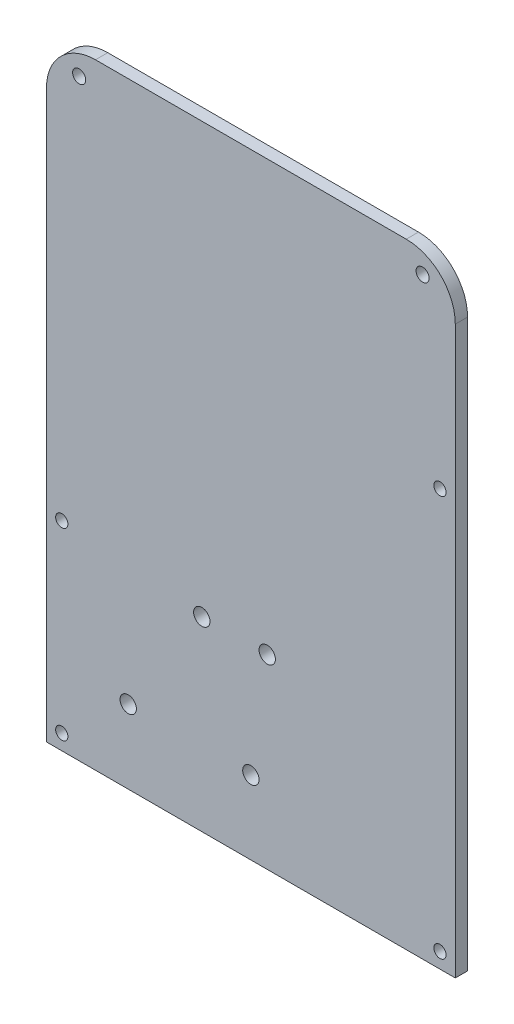
ISO-10303-21;
HEADER;
FILE_DESCRIPTION(('STEP AP214'),'2;1');
FILE_NAME('part.step','',(''),(''),'','','');
FILE_SCHEMA(('AUTOMOTIVE_DESIGN { 1 0 10303 214 1 1 1 1 }'));
ENDSEC;
DATA;
#1=APPLICATION_CONTEXT('core data for automotive mechanical design processes');
#2=APPLICATION_PROTOCOL_DEFINITION('international standard','automotive_design',2000,#1);
#3=PRODUCT_CONTEXT('',#1,'mechanical');
#4=PRODUCT('Part','Part','',(#3));
#5=PRODUCT_RELATED_PRODUCT_CATEGORY('part','',(#4));
#6=PRODUCT_DEFINITION_FORMATION('','',#4);
#7=PRODUCT_DEFINITION_CONTEXT('part definition',#1,'design');
#8=PRODUCT_DEFINITION('design','',#6,#7);
#9=PRODUCT_DEFINITION_SHAPE('','',#8);
#10=(LENGTH_UNIT() NAMED_UNIT(*) SI_UNIT(.MILLI.,.METRE.));
#11=(NAMED_UNIT(*) PLANE_ANGLE_UNIT() SI_UNIT($,.RADIAN.));
#12=(NAMED_UNIT(*) SI_UNIT($,.STERADIAN.) SOLID_ANGLE_UNIT());
#13=UNCERTAINTY_MEASURE_WITH_UNIT(LENGTH_MEASURE(1.E-05),#10,'distance_accuracy_value','');
#14=(GEOMETRIC_REPRESENTATION_CONTEXT(3) GLOBAL_UNCERTAINTY_ASSIGNED_CONTEXT((#13)) GLOBAL_UNIT_ASSIGNED_CONTEXT((#10,
#11,#12)) REPRESENTATION_CONTEXT('',''));
#15=CARTESIAN_POINT('',(0.,0.,0.));
#16=DIRECTION('',(0.,0.,1.));
#17=DIRECTION('',(1.,0.,0.));
#18=AXIS2_PLACEMENT_3D('',#15,#16,#17);
#19=CARTESIAN_POINT('',(-160.53479172773,-113.267977094627,3.));
#20=DIRECTION('',(1.,0.,0.));
#21=DIRECTION('',(0.,0.,-1.));
#22=AXIS2_PLACEMENT_3D('',#19,#20,#21);
#23=PLANE('',#22);
#24=DIRECTION('',(0.,-1.,0.));
#25=VECTOR('',#24,1.);
#26=CARTESIAN_POINT('',(-160.53479172773,-113.267977094627,3.));
#27=LINE('',#26,#25);
#28=CARTESIAN_POINT('',(-160.53479172773,25.2320229053735,3.));
#29=VERTEX_POINT('',#28);
#30=CARTESIAN_POINT('',(-160.53479172773,-113.267977094627,3.));
#31=VERTEX_POINT('',#30);
#32=EDGE_CURVE('E111',#29,#31,#27,.T.);
#33=ORIENTED_EDGE('',*,*,#32,.F.);
#34=DIRECTION('',(0.,0.,-1.));
#35=VECTOR('',#34,1.);
#36=CARTESIAN_POINT('',(-160.53479172773,25.2320229053735,3.));
#37=LINE('',#36,#35);
#38=CARTESIAN_POINT('',(-160.53479172773,25.2320229053735,0.));
#39=VERTEX_POINT('',#38);
#40=EDGE_CURVE('E136',#29,#39,#37,.T.);
#41=ORIENTED_EDGE('',*,*,#40,.T.);
#42=DIRECTION('',(0.,-1.,0.));
#43=VECTOR('',#42,1.);
#44=CARTESIAN_POINT('',(-160.53479172773,-113.267977094627,0.));
#45=LINE('',#44,#43);
#46=CARTESIAN_POINT('',(-160.53479172773,-113.267977094627,0.));
#47=VERTEX_POINT('',#46);
#48=EDGE_CURVE('E134',#39,#47,#45,.T.);
#49=ORIENTED_EDGE('',*,*,#48,.T.);
#50=DIRECTION('',(0.,0.,-1.));
#51=VECTOR('',#50,1.);
#52=CARTESIAN_POINT('',(-160.53479172773,-113.267977094627,3.));
#53=LINE('',#52,#51);
#54=EDGE_CURVE('E127',#31,#47,#53,.T.);
#55=ORIENTED_EDGE('',*,*,#54,.F.);
#56=EDGE_LOOP('',(#33,#41,#49,#55));
#57=FACE_BOUND('',#56,.T.);
#58=ADVANCED_FACE('F47',(#57),#23,.F.);
#59=CARTESIAN_POINT('',(-160.53479172773,-113.267977094627,3.));
#60=DIRECTION('',(0.,1.,0.));
#61=DIRECTION('',(0.,0.,1.));
#62=AXIS2_PLACEMENT_3D('',#59,#60,#61);
#63=PLANE('',#62);
#64=DIRECTION('',(1.,0.,0.));
#65=VECTOR('',#64,1.);
#66=CARTESIAN_POINT('',(-160.53479172773,-113.267977094627,0.));
#67=LINE('',#66,#65);
#68=CARTESIAN_POINT('',(-60.53479172773,-113.267977094627,0.));
#69=VERTEX_POINT('',#68);
#70=EDGE_CURVE('E238',#47,#69,#67,.T.);
#71=ORIENTED_EDGE('',*,*,#70,.T.);
#72=DIRECTION('',(0.,0.,-1.));
#73=VECTOR('',#72,1.);
#74=CARTESIAN_POINT('',(-60.53479172773,-113.267977094627,3.));
#75=LINE('',#74,#73);
#76=CARTESIAN_POINT('',(-60.53479172773,-113.267977094627,3.));
#77=VERTEX_POINT('',#76);
#78=EDGE_CURVE('E129',#77,#69,#75,.T.);
#79=ORIENTED_EDGE('',*,*,#78,.F.);
#80=DIRECTION('',(1.,0.,0.));
#81=VECTOR('',#80,1.);
#82=CARTESIAN_POINT('',(-160.53479172773,-113.267977094627,3.));
#83=LINE('',#82,#81);
#84=EDGE_CURVE('E114',#31,#77,#83,.T.);
#85=ORIENTED_EDGE('',*,*,#84,.F.);
#86=ORIENTED_EDGE('',*,*,#54,.T.);
#87=EDGE_LOOP('',(#71,#79,#85,#86));
#88=FACE_BOUND('',#87,.T.);
#89=ADVANCED_FACE('F126',(#88),#63,.F.);
#90=CARTESIAN_POINT('',(-60.53479172773,-113.267977094627,3.));
#91=DIRECTION('',(-1.,0.,0.));
#92=DIRECTION('',(0.,0.,1.));
#93=AXIS2_PLACEMENT_3D('',#90,#91,#92);
#94=PLANE('',#93);
#95=DIRECTION('',(0.,1.,0.));
#96=VECTOR('',#95,1.);
#97=CARTESIAN_POINT('',(-60.53479172773,-113.267977094627,0.));
#98=LINE('',#97,#96);
#99=CARTESIAN_POINT('',(-60.53479172773,25.2320229053735,0.));
#100=VERTEX_POINT('',#99);
#101=EDGE_CURVE('E241',#69,#100,#98,.T.);
#102=ORIENTED_EDGE('',*,*,#101,.T.);
#103=DIRECTION('',(0.,0.,-1.));
#104=VECTOR('',#103,1.);
#105=CARTESIAN_POINT('',(-60.53479172773,25.2320229053735,3.));
#106=LINE('',#105,#104);
#107=CARTESIAN_POINT('',(-60.53479172773,25.2320229053735,3.));
#108=VERTEX_POINT('',#107);
#109=EDGE_CURVE('E11',#100,#108,#106,.F.);
#110=ORIENTED_EDGE('',*,*,#109,.T.);
#111=DIRECTION('',(0.,1.,0.));
#112=VECTOR('',#111,1.);
#113=CARTESIAN_POINT('',(-60.53479172773,-113.267977094627,3.));
#114=LINE('',#113,#112);
#115=EDGE_CURVE('E131',#77,#108,#114,.T.);
#116=ORIENTED_EDGE('',*,*,#115,.F.);
#117=ORIENTED_EDGE('',*,*,#78,.T.);
#118=EDGE_LOOP('',(#102,#110,#116,#117));
#119=FACE_BOUND('',#118,.T.);
#120=ADVANCED_FACE('F252',(#119),#94,.F.);
#121=CARTESIAN_POINT('',(-160.53479172773,37.2320229053735,3.));
#122=DIRECTION('',(0.,-1.,0.));
#123=DIRECTION('',(0.,0.,-1.));
#124=AXIS2_PLACEMENT_3D('',#121,#122,#123);
#125=PLANE('',#124);
#126=DIRECTION('',(-1.,0.,0.));
#127=VECTOR('',#126,1.);
#128=CARTESIAN_POINT('',(-160.53479172773,37.2320229053735,0.));
#129=LINE('',#128,#127);
#130=CARTESIAN_POINT('',(-72.53479172773,37.2320229053735,0.));
#131=VERTEX_POINT('',#130);
#132=CARTESIAN_POINT('',(-148.53479172773,37.2320229053735,0.));
#133=VERTEX_POINT('',#132);
#134=EDGE_CURVE('E122',#131,#133,#129,.T.);
#135=ORIENTED_EDGE('',*,*,#134,.T.);
#136=DIRECTION('',(0.,0.,-1.));
#137=VECTOR('',#136,1.);
#138=CARTESIAN_POINT('',(-148.53479172773,37.2320229053735,3.));
#139=LINE('',#138,#137);
#140=CARTESIAN_POINT('',(-148.53479172773,37.2320229053735,3.));
#141=VERTEX_POINT('',#140);
#142=EDGE_CURVE('E76',#133,#141,#139,.F.);
#143=ORIENTED_EDGE('',*,*,#142,.T.);
#144=DIRECTION('',(-1.,0.,0.));
#145=VECTOR('',#144,1.);
#146=CARTESIAN_POINT('',(-160.53479172773,37.2320229053735,3.));
#147=LINE('',#146,#145);
#148=CARTESIAN_POINT('',(-72.53479172773,37.2320229053735,3.));
#149=VERTEX_POINT('',#148);
#150=EDGE_CURVE('E142',#149,#141,#147,.T.);
#151=ORIENTED_EDGE('',*,*,#150,.F.);
#152=DIRECTION('',(0.,0.,-1.));
#153=VECTOR('',#152,1.);
#154=CARTESIAN_POINT('',(-72.53479172773,37.2320229053735,3.));
#155=LINE('',#154,#153);
#156=EDGE_CURVE('E150',#149,#131,#155,.T.);
#157=ORIENTED_EDGE('',*,*,#156,.T.);
#158=EDGE_LOOP('',(#135,#143,#151,#157));
#159=FACE_BOUND('',#158,.T.);
#160=ADVANCED_FACE('F245',(#159),#125,.F.);
#161=CARTESIAN_POINT('',(0.,0.,3.));
#162=DIRECTION('',(0.,0.,-1.));
#163=DIRECTION('',(-1.,0.,0.));
#164=AXIS2_PLACEMENT_3D('',#161,#162,#163);
#165=PLANE('',#164);
#166=CARTESIAN_POINT('',(-152.53479172773,31.7320229053735,3.));
#167=DIRECTION('',(0.,0.,1.));
#168=DIRECTION('',(1.,0.,0.));
#169=AXIS2_PLACEMENT_3D('',#166,#167,#168);
#170=CIRCLE('',#169,1.59999999999999);
#171=CARTESIAN_POINT('',(-150.93479172773,31.7320229053735,3.));
#172=VERTEX_POINT('',#171);
#173=EDGE_CURVE('E161',#172,#172,#170,.T.);
#174=ORIENTED_EDGE('',*,*,#173,.F.);
#175=EDGE_LOOP('',(#174));
#176=FACE_BOUND('',#175,.T.);
#177=CARTESIAN_POINT('',(-68.53479172773,31.7320229053735,3.));
#178=DIRECTION('',(0.,0.,1.));
#179=DIRECTION('',(1.,0.,0.));
#180=AXIS2_PLACEMENT_3D('',#177,#178,#179);
#181=CIRCLE('',#180,1.60000000000001);
#182=CARTESIAN_POINT('',(-66.93479172773,31.7320229053735,3.));
#183=VERTEX_POINT('',#182);
#184=EDGE_CURVE('E169',#183,#183,#181,.T.);
#185=ORIENTED_EDGE('',*,*,#184,.F.);
#186=EDGE_LOOP('',(#185));
#187=FACE_BOUND('',#186,.T.);
#188=CARTESIAN_POINT('',(-140.53479172773,-95.2679770946265,3.));
#189=DIRECTION('',(0.,0.,1.));
#190=DIRECTION('',(1.,0.,0.));
#191=AXIS2_PLACEMENT_3D('',#188,#189,#190);
#192=CIRCLE('',#191,2.);
#193=CARTESIAN_POINT('',(-138.53479172773,-95.2679770946265,3.));
#194=VERTEX_POINT('',#193);
#195=EDGE_CURVE('E183',#194,#194,#192,.T.);
#196=ORIENTED_EDGE('',*,*,#195,.F.);
#197=EDGE_LOOP('',(#196));
#198=FACE_BOUND('',#197,.T.);
#199=CARTESIAN_POINT('',(-110.53479172773,-95.2679770946265,3.));
#200=DIRECTION('',(0.,0.,1.));
#201=DIRECTION('',(1.,0.,0.));
#202=AXIS2_PLACEMENT_3D('',#199,#200,#201);
#203=CIRCLE('',#202,2.);
#204=CARTESIAN_POINT('',(-108.53479172773,-95.2679770946265,3.));
#205=VERTEX_POINT('',#204);
#206=EDGE_CURVE('E187',#205,#205,#203,.T.);
#207=ORIENTED_EDGE('',*,*,#206,.F.);
#208=EDGE_LOOP('',(#207));
#209=FACE_BOUND('',#208,.T.);
#210=CARTESIAN_POINT('',(-106.53479172773,-67.7679770946265,3.));
#211=DIRECTION('',(0.,0.,1.));
#212=DIRECTION('',(1.,0.,0.));
#213=AXIS2_PLACEMENT_3D('',#210,#211,#212);
#214=CIRCLE('',#213,2.);
#215=CARTESIAN_POINT('',(-104.53479172773,-67.7679770946265,3.));
#216=VERTEX_POINT('',#215);
#217=EDGE_CURVE('E195',#216,#216,#214,.T.);
#218=ORIENTED_EDGE('',*,*,#217,.F.);
#219=EDGE_LOOP('',(#218));
#220=FACE_BOUND('',#219,.T.);
#221=CARTESIAN_POINT('',(-122.53479172773,-67.7679770946265,3.));
#222=DIRECTION('',(0.,0.,1.));
#223=DIRECTION('',(1.,0.,0.));
#224=AXIS2_PLACEMENT_3D('',#221,#222,#223);
#225=CIRCLE('',#224,2.);
#226=CARTESIAN_POINT('',(-120.53479172773,-67.7679770946265,3.));
#227=VERTEX_POINT('',#226);
#228=EDGE_CURVE('E201',#227,#227,#225,.T.);
#229=ORIENTED_EDGE('',*,*,#228,.F.);
#230=EDGE_LOOP('',(#229));
#231=FACE_BOUND('',#230,.T.);
#232=CARTESIAN_POINT('',(-156.78479172773,-64.5179770946265,3.));
#233=DIRECTION('',(0.,0.,1.));
#234=DIRECTION('',(1.,0.,0.));
#235=AXIS2_PLACEMENT_3D('',#232,#233,#234);
#236=CIRCLE('',#235,1.5);
#237=CARTESIAN_POINT('',(-155.28479172773,-64.5179770946265,3.));
#238=VERTEX_POINT('',#237);
#239=EDGE_CURVE('E223',#238,#238,#236,.T.);
#240=ORIENTED_EDGE('',*,*,#239,.F.);
#241=EDGE_LOOP('',(#240));
#242=FACE_BOUND('',#241,.T.);
#243=CARTESIAN_POINT('',(-64.28479172773,-11.5179770946265,3.));
#244=DIRECTION('',(0.,0.,1.));
#245=DIRECTION('',(1.,0.,0.));
#246=AXIS2_PLACEMENT_3D('',#243,#244,#245);
#247=CIRCLE('',#246,1.5);
#248=CARTESIAN_POINT('',(-62.78479172773,-11.5179770946265,3.));
#249=VERTEX_POINT('',#248);
#250=EDGE_CURVE('E215',#249,#249,#247,.T.);
#251=ORIENTED_EDGE('',*,*,#250,.F.);
#252=EDGE_LOOP('',(#251));
#253=FACE_BOUND('',#252,.T.);
#254=CARTESIAN_POINT('',(-64.28479172773,-109.517977094627,3.));
#255=DIRECTION('',(0.,0.,1.));
#256=DIRECTION('',(1.,0.,0.));
#257=AXIS2_PLACEMENT_3D('',#254,#255,#256);
#258=CIRCLE('',#257,1.5);
#259=CARTESIAN_POINT('',(-62.78479172773,-109.517977094627,3.));
#260=VERTEX_POINT('',#259);
#261=EDGE_CURVE('E206',#260,#260,#258,.T.);
#262=ORIENTED_EDGE('',*,*,#261,.F.);
#263=EDGE_LOOP('',(#262));
#264=FACE_BOUND('',#263,.T.);
#265=CARTESIAN_POINT('',(-156.78479172773,-109.517977094627,3.));
#266=DIRECTION('',(0.,0.,1.));
#267=DIRECTION('',(1.,0.,0.));
#268=AXIS2_PLACEMENT_3D('',#265,#266,#267);
#269=CIRCLE('',#268,1.5);
#270=CARTESIAN_POINT('',(-155.28479172773,-109.517977094627,3.));
#271=VERTEX_POINT('',#270);
#272=EDGE_CURVE('E210',#271,#271,#269,.T.);
#273=ORIENTED_EDGE('',*,*,#272,.F.);
#274=EDGE_LOOP('',(#273));
#275=FACE_BOUND('',#274,.T.);
#276=ORIENTED_EDGE('',*,*,#150,.T.);
#277=CARTESIAN_POINT('',(-148.53479172773,25.2320229053735,3.));
#278=DIRECTION('',(0.,0.,-1.));
#279=DIRECTION('',(-1.,0.,0.));
#280=AXIS2_PLACEMENT_3D('',#277,#278,#279);
#281=CIRCLE('',#280,12.);
#282=EDGE_CURVE('E57',#141,#29,#281,.F.);
#283=ORIENTED_EDGE('',*,*,#282,.T.);
#284=ORIENTED_EDGE('',*,*,#32,.T.);
#285=ORIENTED_EDGE('',*,*,#84,.T.);
#286=ORIENTED_EDGE('',*,*,#115,.T.);
#287=CARTESIAN_POINT('',(-72.53479172773,25.2320229053735,3.));
#288=DIRECTION('',(0.,0.,-1.));
#289=DIRECTION('',(-1.,0.,0.));
#290=AXIS2_PLACEMENT_3D('',#287,#288,#289);
#291=CIRCLE('',#290,12.);
#292=EDGE_CURVE('E155',#108,#149,#291,.F.);
#293=ORIENTED_EDGE('',*,*,#292,.T.);
#294=EDGE_LOOP('',(#276,#283,#284,#285,#286,#293));
#295=FACE_BOUND('',#294,.T.);
#296=ADVANCED_FACE('F113',(#176,#187,#198,#209,#220,#231,#242,#253,#264,#275,#295),#165,.F.);
#297=CARTESIAN_POINT('',(0.,0.,0.));
#298=DIRECTION('',(0.,0.,-1.));
#299=DIRECTION('',(-1.,0.,0.));
#300=AXIS2_PLACEMENT_3D('',#297,#298,#299);
#301=PLANE('',#300);
#302=CARTESIAN_POINT('',(-152.53479172773,31.7320229053735,0.));
#303=DIRECTION('',(0.,0.,-1.));
#304=DIRECTION('',(-1.,0.,0.));
#305=AXIS2_PLACEMENT_3D('',#302,#303,#304);
#306=CIRCLE('',#305,1.59999999999999);
#307=CARTESIAN_POINT('',(-154.13479172773,31.7320229053735,0.));
#308=VERTEX_POINT('',#307);
#309=EDGE_CURVE('E51',#308,#308,#306,.T.);
#310=ORIENTED_EDGE('',*,*,#309,.F.);
#311=EDGE_LOOP('',(#310));
#312=FACE_BOUND('',#311,.T.);
#313=CARTESIAN_POINT('',(-68.53479172773,31.7320229053735,0.));
#314=DIRECTION('',(0.,0.,-1.));
#315=DIRECTION('',(-1.,0.,0.));
#316=AXIS2_PLACEMENT_3D('',#313,#314,#315);
#317=CIRCLE('',#316,1.60000000000001);
#318=CARTESIAN_POINT('',(-70.13479172773,31.7320229053735,0.));
#319=VERTEX_POINT('',#318);
#320=EDGE_CURVE('E159',#319,#319,#317,.T.);
#321=ORIENTED_EDGE('',*,*,#320,.F.);
#322=EDGE_LOOP('',(#321));
#323=FACE_BOUND('',#322,.T.);
#324=CARTESIAN_POINT('',(-140.53479172773,-95.2679770946265,0.));
#325=DIRECTION('',(0.,0.,1.));
#326=DIRECTION('',(1.,0.,0.));
#327=AXIS2_PLACEMENT_3D('',#324,#325,#326);
#328=CIRCLE('',#327,2.);
#329=CARTESIAN_POINT('',(-138.53479172773,-95.2679770946265,0.));
#330=VERTEX_POINT('',#329);
#331=EDGE_CURVE('E178',#330,#330,#328,.T.);
#332=ORIENTED_EDGE('',*,*,#331,.T.);
#333=EDGE_LOOP('',(#332));
#334=FACE_BOUND('',#333,.T.);
#335=CARTESIAN_POINT('',(-110.53479172773,-95.2679770946265,0.));
#336=DIRECTION('',(0.,0.,1.));
#337=DIRECTION('',(1.,0.,0.));
#338=AXIS2_PLACEMENT_3D('',#335,#336,#337);
#339=CIRCLE('',#338,2.);
#340=CARTESIAN_POINT('',(-108.53479172773,-95.2679770946265,0.));
#341=VERTEX_POINT('',#340);
#342=EDGE_CURVE('E191',#341,#341,#339,.T.);
#343=ORIENTED_EDGE('',*,*,#342,.T.);
#344=EDGE_LOOP('',(#343));
#345=FACE_BOUND('',#344,.T.);
#346=CARTESIAN_POINT('',(-106.53479172773,-67.7679770946265,0.));
#347=DIRECTION('',(0.,0.,1.));
#348=DIRECTION('',(1.,0.,0.));
#349=AXIS2_PLACEMENT_3D('',#346,#347,#348);
#350=CIRCLE('',#349,2.);
#351=CARTESIAN_POINT('',(-104.53479172773,-67.7679770946265,0.));
#352=VERTEX_POINT('',#351);
#353=EDGE_CURVE('E198',#352,#352,#350,.T.);
#354=ORIENTED_EDGE('',*,*,#353,.T.);
#355=EDGE_LOOP('',(#354));
#356=FACE_BOUND('',#355,.T.);
#357=CARTESIAN_POINT('',(-122.53479172773,-67.7679770946265,0.));
#358=DIRECTION('',(0.,0.,1.));
#359=DIRECTION('',(1.,0.,0.));
#360=AXIS2_PLACEMENT_3D('',#357,#358,#359);
#361=CIRCLE('',#360,2.);
#362=CARTESIAN_POINT('',(-120.53479172773,-67.7679770946265,0.));
#363=VERTEX_POINT('',#362);
#364=EDGE_CURVE('E166',#363,#363,#361,.T.);
#365=ORIENTED_EDGE('',*,*,#364,.T.);
#366=EDGE_LOOP('',(#365));
#367=FACE_BOUND('',#366,.T.);
#368=CARTESIAN_POINT('',(-156.78479172773,-64.5179770946265,0.));
#369=DIRECTION('',(0.,0.,1.));
#370=DIRECTION('',(1.,0.,0.));
#371=AXIS2_PLACEMENT_3D('',#368,#369,#370);
#372=CIRCLE('',#371,1.5);
#373=CARTESIAN_POINT('',(-155.28479172773,-64.5179770946265,0.));
#374=VERTEX_POINT('',#373);
#375=EDGE_CURVE('E182',#374,#374,#372,.T.);
#376=ORIENTED_EDGE('',*,*,#375,.T.);
#377=EDGE_LOOP('',(#376));
#378=FACE_BOUND('',#377,.T.);
#379=CARTESIAN_POINT('',(-64.28479172773,-11.5179770946265,0.));
#380=DIRECTION('',(0.,0.,1.));
#381=DIRECTION('',(1.,0.,0.));
#382=AXIS2_PLACEMENT_3D('',#379,#380,#381);
#383=CIRCLE('',#382,1.5);
#384=CARTESIAN_POINT('',(-62.78479172773,-11.5179770946265,0.));
#385=VERTEX_POINT('',#384);
#386=EDGE_CURVE('E219',#385,#385,#383,.T.);
#387=ORIENTED_EDGE('',*,*,#386,.T.);
#388=EDGE_LOOP('',(#387));
#389=FACE_BOUND('',#388,.T.);
#390=CARTESIAN_POINT('',(-64.28479172773,-109.517977094627,0.));
#391=DIRECTION('',(0.,0.,1.));
#392=DIRECTION('',(1.,0.,0.));
#393=AXIS2_PLACEMENT_3D('',#390,#391,#392);
#394=CIRCLE('',#393,1.5);
#395=CARTESIAN_POINT('',(-62.78479172773,-109.517977094627,0.));
#396=VERTEX_POINT('',#395);
#397=EDGE_CURVE('E211',#396,#396,#394,.T.);
#398=ORIENTED_EDGE('',*,*,#397,.T.);
#399=EDGE_LOOP('',(#398));
#400=FACE_BOUND('',#399,.T.);
#401=CARTESIAN_POINT('',(-156.78479172773,-109.517977094627,0.));
#402=DIRECTION('',(0.,0.,1.));
#403=DIRECTION('',(1.,0.,0.));
#404=AXIS2_PLACEMENT_3D('',#401,#402,#403);
#405=CIRCLE('',#404,1.5);
#406=CARTESIAN_POINT('',(-155.28479172773,-109.517977094627,0.));
#407=VERTEX_POINT('',#406);
#408=EDGE_CURVE('E228',#407,#407,#405,.T.);
#409=ORIENTED_EDGE('',*,*,#408,.T.);
#410=EDGE_LOOP('',(#409));
#411=FACE_BOUND('',#410,.T.);
#412=ORIENTED_EDGE('',*,*,#48,.F.);
#413=CARTESIAN_POINT('',(-148.53479172773,25.2320229053735,0.));
#414=DIRECTION('',(0.,0.,-1.));
#415=DIRECTION('',(-1.,0.,0.));
#416=AXIS2_PLACEMENT_3D('',#413,#414,#415);
#417=CIRCLE('',#416,12.);
#418=EDGE_CURVE('E147',#39,#133,#417,.T.);
#419=ORIENTED_EDGE('',*,*,#418,.T.);
#420=ORIENTED_EDGE('',*,*,#134,.F.);
#421=CARTESIAN_POINT('',(-72.53479172773,25.2320229053735,0.));
#422=DIRECTION('',(0.,0.,-1.));
#423=DIRECTION('',(-1.,0.,0.));
#424=AXIS2_PLACEMENT_3D('',#421,#422,#423);
#425=CIRCLE('',#424,12.);
#426=EDGE_CURVE('E139',#131,#100,#425,.T.);
#427=ORIENTED_EDGE('',*,*,#426,.T.);
#428=ORIENTED_EDGE('',*,*,#101,.F.);
#429=ORIENTED_EDGE('',*,*,#70,.F.);
#430=EDGE_LOOP('',(#412,#419,#420,#427,#428,#429));
#431=FACE_BOUND('',#430,.T.);
#432=ADVANCED_FACE('F250',(#312,#323,#334,#345,#356,#367,#378,#389,#400,#411,#431),#301,.T.);
#433=CARTESIAN_POINT('',(-156.78479172773,-109.517977094627,0.));
#434=DIRECTION('',(0.,0.,1.));
#435=DIRECTION('',(1.,0.,0.));
#436=AXIS2_PLACEMENT_3D('',#433,#434,#435);
#437=CYLINDRICAL_SURFACE('',#436,1.5);
#438=ORIENTED_EDGE('',*,*,#408,.F.);
#439=EDGE_LOOP('',(#438));
#440=FACE_BOUND('',#439,.T.);
#441=ORIENTED_EDGE('',*,*,#272,.T.);
#442=EDGE_LOOP('',(#441));
#443=FACE_BOUND('',#442,.T.);
#444=ADVANCED_FACE('F277',(#440,#443),#437,.F.);
#445=CARTESIAN_POINT('',(-64.28479172773,-109.517977094627,0.));
#446=DIRECTION('',(0.,0.,1.));
#447=DIRECTION('',(1.,0.,0.));
#448=AXIS2_PLACEMENT_3D('',#445,#446,#447);
#449=CYLINDRICAL_SURFACE('',#448,1.5);
#450=ORIENTED_EDGE('',*,*,#397,.F.);
#451=EDGE_LOOP('',(#450));
#452=FACE_BOUND('',#451,.T.);
#453=ORIENTED_EDGE('',*,*,#261,.T.);
#454=EDGE_LOOP('',(#453));
#455=FACE_BOUND('',#454,.T.);
#456=ADVANCED_FACE('F284',(#452,#455),#449,.F.);
#457=CARTESIAN_POINT('',(-64.28479172773,-11.5179770946265,0.));
#458=DIRECTION('',(0.,0.,1.));
#459=DIRECTION('',(1.,0.,0.));
#460=AXIS2_PLACEMENT_3D('',#457,#458,#459);
#461=CYLINDRICAL_SURFACE('',#460,1.5);
#462=ORIENTED_EDGE('',*,*,#386,.F.);
#463=EDGE_LOOP('',(#462));
#464=FACE_BOUND('',#463,.T.);
#465=ORIENTED_EDGE('',*,*,#250,.T.);
#466=EDGE_LOOP('',(#465));
#467=FACE_BOUND('',#466,.T.);
#468=ADVANCED_FACE('F290',(#464,#467),#461,.F.);
#469=CARTESIAN_POINT('',(-156.78479172773,-64.5179770946265,0.));
#470=DIRECTION('',(0.,0.,1.));
#471=DIRECTION('',(1.,0.,0.));
#472=AXIS2_PLACEMENT_3D('',#469,#470,#471);
#473=CYLINDRICAL_SURFACE('',#472,1.5);
#474=ORIENTED_EDGE('',*,*,#375,.F.);
#475=EDGE_LOOP('',(#474));
#476=FACE_BOUND('',#475,.T.);
#477=ORIENTED_EDGE('',*,*,#239,.T.);
#478=EDGE_LOOP('',(#477));
#479=FACE_BOUND('',#478,.T.);
#480=ADVANCED_FACE('F286',(#476,#479),#473,.F.);
#481=CARTESIAN_POINT('',(-122.53479172773,-67.7679770946265,0.));
#482=DIRECTION('',(0.,0.,1.));
#483=DIRECTION('',(1.,0.,0.));
#484=AXIS2_PLACEMENT_3D('',#481,#482,#483);
#485=CYLINDRICAL_SURFACE('',#484,2.);
#486=ORIENTED_EDGE('',*,*,#364,.F.);
#487=EDGE_LOOP('',(#486));
#488=FACE_BOUND('',#487,.T.);
#489=ORIENTED_EDGE('',*,*,#228,.T.);
#490=EDGE_LOOP('',(#489));
#491=FACE_BOUND('',#490,.T.);
#492=ADVANCED_FACE('F289',(#488,#491),#485,.F.);
#493=CARTESIAN_POINT('',(-106.53479172773,-67.7679770946265,0.));
#494=DIRECTION('',(0.,0.,1.));
#495=DIRECTION('',(1.,0.,0.));
#496=AXIS2_PLACEMENT_3D('',#493,#494,#495);
#497=CYLINDRICAL_SURFACE('',#496,2.);
#498=ORIENTED_EDGE('',*,*,#353,.F.);
#499=EDGE_LOOP('',(#498));
#500=FACE_BOUND('',#499,.T.);
#501=ORIENTED_EDGE('',*,*,#217,.T.);
#502=EDGE_LOOP('',(#501));
#503=FACE_BOUND('',#502,.T.);
#504=ADVANCED_FACE('F300',(#500,#503),#497,.F.);
#505=CARTESIAN_POINT('',(-110.53479172773,-95.2679770946265,0.));
#506=DIRECTION('',(0.,0.,1.));
#507=DIRECTION('',(1.,0.,0.));
#508=AXIS2_PLACEMENT_3D('',#505,#506,#507);
#509=CYLINDRICAL_SURFACE('',#508,2.);
#510=ORIENTED_EDGE('',*,*,#342,.F.);
#511=EDGE_LOOP('',(#510));
#512=FACE_BOUND('',#511,.T.);
#513=ORIENTED_EDGE('',*,*,#206,.T.);
#514=EDGE_LOOP('',(#513));
#515=FACE_BOUND('',#514,.T.);
#516=ADVANCED_FACE('F304',(#512,#515),#509,.F.);
#517=CARTESIAN_POINT('',(-140.53479172773,-95.2679770946265,0.));
#518=DIRECTION('',(0.,0.,1.));
#519=DIRECTION('',(1.,0.,0.));
#520=AXIS2_PLACEMENT_3D('',#517,#518,#519);
#521=CYLINDRICAL_SURFACE('',#520,2.);
#522=ORIENTED_EDGE('',*,*,#331,.F.);
#523=EDGE_LOOP('',(#522));
#524=FACE_BOUND('',#523,.T.);
#525=ORIENTED_EDGE('',*,*,#195,.T.);
#526=EDGE_LOOP('',(#525));
#527=FACE_BOUND('',#526,.T.);
#528=ADVANCED_FACE('F263',(#524,#527),#521,.F.);
#529=CARTESIAN_POINT('',(-148.53479172773,25.2320229053735,3.));
#530=DIRECTION('',(0.,0.,-1.));
#531=DIRECTION('',(-1.,0.,0.));
#532=AXIS2_PLACEMENT_3D('',#529,#530,#531);
#533=CYLINDRICAL_SURFACE('',#532,12.);
#534=ORIENTED_EDGE('',*,*,#282,.F.);
#535=ORIENTED_EDGE('',*,*,#142,.F.);
#536=ORIENTED_EDGE('',*,*,#418,.F.);
#537=ORIENTED_EDGE('',*,*,#40,.F.);
#538=EDGE_LOOP('',(#534,#535,#536,#537));
#539=FACE_BOUND('',#538,.T.);
#540=ADVANCED_FACE('F249',(#539),#533,.T.);
#541=CARTESIAN_POINT('',(-72.53479172773,25.2320229053735,3.));
#542=DIRECTION('',(0.,0.,-1.));
#543=DIRECTION('',(-1.,0.,0.));
#544=AXIS2_PLACEMENT_3D('',#541,#542,#543);
#545=CYLINDRICAL_SURFACE('',#544,12.);
#546=ORIENTED_EDGE('',*,*,#292,.F.);
#547=ORIENTED_EDGE('',*,*,#109,.F.);
#548=ORIENTED_EDGE('',*,*,#426,.F.);
#549=ORIENTED_EDGE('',*,*,#156,.F.);
#550=EDGE_LOOP('',(#546,#547,#548,#549));
#551=FACE_BOUND('',#550,.T.);
#552=ADVANCED_FACE('F49',(#551),#545,.T.);
#553=CARTESIAN_POINT('',(-68.53479172773,31.7320229053735,-7.));
#554=DIRECTION('',(0.,0.,1.));
#555=DIRECTION('',(1.,0.,0.));
#556=AXIS2_PLACEMENT_3D('',#553,#554,#555);
#557=CYLINDRICAL_SURFACE('',#556,1.60000000000001);
#558=ORIENTED_EDGE('',*,*,#320,.T.);
#559=EDGE_LOOP('',(#558));
#560=FACE_BOUND('',#559,.T.);
#561=ORIENTED_EDGE('',*,*,#184,.T.);
#562=EDGE_LOOP('',(#561));
#563=FACE_BOUND('',#562,.T.);
#564=ADVANCED_FACE('F256',(#560,#563),#557,.F.);
#565=CARTESIAN_POINT('',(-152.53479172773,31.7320229053735,-7.));
#566=DIRECTION('',(0.,0.,1.));
#567=DIRECTION('',(1.,0.,0.));
#568=AXIS2_PLACEMENT_3D('',#565,#566,#567);
#569=CYLINDRICAL_SURFACE('',#568,1.59999999999999);
#570=ORIENTED_EDGE('',*,*,#309,.T.);
#571=EDGE_LOOP('',(#570));
#572=FACE_BOUND('',#571,.T.);
#573=ORIENTED_EDGE('',*,*,#173,.T.);
#574=EDGE_LOOP('',(#573));
#575=FACE_BOUND('',#574,.T.);
#576=ADVANCED_FACE('F261',(#572,#575),#569,.F.);
#577=CLOSED_SHELL('',(#58,#89,#120,#160,#296,#432,#444,#456,#468,#480,#492,#504,#516,#528,#540,
#552,#564,#576));
#578=MANIFOLD_SOLID_BREP('B2',#577);
#579=ADVANCED_BREP_SHAPE_REPRESENTATION('',(#18,#578),#14);
#580=SHAPE_DEFINITION_REPRESENTATION(#9,#579);
ENDSEC;
END-ISO-10303-21;
